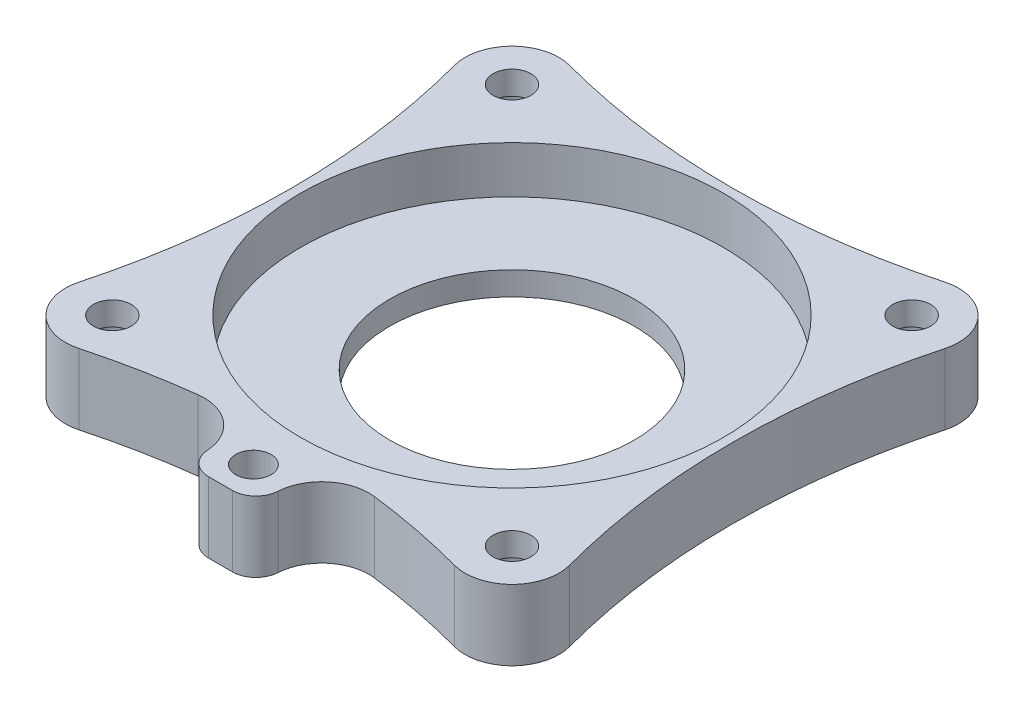
ISO-10303-21;
HEADER;
FILE_DESCRIPTION(('STEP AP214'),'2;1');
FILE_NAME('part.step','',(''),(''),'','','');
FILE_SCHEMA(('AUTOMOTIVE_DESIGN { 1 0 10303 214 1 1 1 1 }'));
ENDSEC;
DATA;
#1=APPLICATION_CONTEXT('core data for automotive mechanical design processes');
#2=APPLICATION_PROTOCOL_DEFINITION('international standard','automotive_design',2000,#1);
#3=PRODUCT_CONTEXT('',#1,'mechanical');
#4=PRODUCT('Part','Part','',(#3));
#5=PRODUCT_RELATED_PRODUCT_CATEGORY('part','',(#4));
#6=PRODUCT_DEFINITION_FORMATION('','',#4);
#7=PRODUCT_DEFINITION_CONTEXT('part definition',#1,'design');
#8=PRODUCT_DEFINITION('design','',#6,#7);
#9=PRODUCT_DEFINITION_SHAPE('','',#8);
#10=(LENGTH_UNIT() NAMED_UNIT(*) SI_UNIT(.MILLI.,.METRE.));
#11=(NAMED_UNIT(*) PLANE_ANGLE_UNIT() SI_UNIT($,.RADIAN.));
#12=(NAMED_UNIT(*) SI_UNIT($,.STERADIAN.) SOLID_ANGLE_UNIT());
#13=UNCERTAINTY_MEASURE_WITH_UNIT(LENGTH_MEASURE(1.E-05),#10,'distance_accuracy_value','');
#14=(GEOMETRIC_REPRESENTATION_CONTEXT(3) GLOBAL_UNCERTAINTY_ASSIGNED_CONTEXT((#13)) GLOBAL_UNIT_ASSIGNED_CONTEXT((#10,
#11,#12)) REPRESENTATION_CONTEXT('',''));
#15=CARTESIAN_POINT('',(0.,0.,0.));
#16=DIRECTION('',(0.,0.,1.));
#17=DIRECTION('',(1.,0.,0.));
#18=AXIS2_PLACEMENT_3D('',#15,#16,#17);
#19=CARTESIAN_POINT('',(6.35,0.,-60.325));
#20=DIRECTION('',(0.,1.,0.));
#21=DIRECTION('',(0.,0.,1.));
#22=AXIS2_PLACEMENT_3D('',#19,#20,#21);
#23=CYLINDRICAL_SURFACE('',#22,2.5527);
#24=CARTESIAN_POINT('',(6.35,9.525,-60.325));
#25=DIRECTION('',(0.,1.,0.));
#26=DIRECTION('',(0.,0.,1.));
#27=AXIS2_PLACEMENT_3D('',#24,#25,#26);
#28=CIRCLE('',#27,2.5527);
#29=CARTESIAN_POINT('',(6.35,9.525,-57.7723));
#30=VERTEX_POINT('',#29);
#31=EDGE_CURVE('E247',#30,#30,#28,.T.);
#32=ORIENTED_EDGE('',*,*,#31,.T.);
#33=EDGE_LOOP('',(#32));
#34=FACE_BOUND('',#33,.T.);
#35=CARTESIAN_POINT('',(6.35,6.35,-60.325));
#36=DIRECTION('',(0.,1.,0.));
#37=DIRECTION('',(0.,0.,1.));
#38=AXIS2_PLACEMENT_3D('',#35,#36,#37);
#39=CIRCLE('',#38,2.5527);
#40=CARTESIAN_POINT('',(6.35,6.35,-57.7723));
#41=VERTEX_POINT('',#40);
#42=EDGE_CURVE('E241',#41,#41,#39,.T.);
#43=ORIENTED_EDGE('',*,*,#42,.F.);
#44=EDGE_LOOP('',(#43));
#45=FACE_BOUND('',#44,.T.);
#46=ADVANCED_FACE('F17',(#34,#45),#23,.F.);
#47=CARTESIAN_POINT('',(60.325,0.,-60.325));
#48=DIRECTION('',(0.,1.,0.));
#49=DIRECTION('',(0.,0.,1.));
#50=AXIS2_PLACEMENT_3D('',#47,#48,#49);
#51=CYLINDRICAL_SURFACE('',#50,2.5527);
#52=CARTESIAN_POINT('',(60.325,9.525,-60.325));
#53=DIRECTION('',(0.,1.,0.));
#54=DIRECTION('',(0.,0.,1.));
#55=AXIS2_PLACEMENT_3D('',#52,#53,#54);
#56=CIRCLE('',#55,2.5527);
#57=CARTESIAN_POINT('',(60.325,9.525,-57.7723));
#58=VERTEX_POINT('',#57);
#59=EDGE_CURVE('E250',#58,#58,#56,.T.);
#60=ORIENTED_EDGE('',*,*,#59,.T.);
#61=EDGE_LOOP('',(#60));
#62=FACE_BOUND('',#61,.T.);
#63=CARTESIAN_POINT('',(60.325,6.35,-60.325));
#64=DIRECTION('',(0.,1.,0.));
#65=DIRECTION('',(0.,0.,1.));
#66=AXIS2_PLACEMENT_3D('',#63,#64,#65);
#67=CIRCLE('',#66,2.5527);
#68=CARTESIAN_POINT('',(60.325,6.35,-57.7723));
#69=VERTEX_POINT('',#68);
#70=EDGE_CURVE('E238',#69,#69,#67,.T.);
#71=ORIENTED_EDGE('',*,*,#70,.F.);
#72=EDGE_LOOP('',(#71));
#73=FACE_BOUND('',#72,.T.);
#74=ADVANCED_FACE('F385',(#62,#73),#51,.F.);
#75=CARTESIAN_POINT('',(60.325,0.,-6.35));
#76=DIRECTION('',(0.,1.,0.));
#77=DIRECTION('',(0.,0.,1.));
#78=AXIS2_PLACEMENT_3D('',#75,#76,#77);
#79=CYLINDRICAL_SURFACE('',#78,2.5527);
#80=CARTESIAN_POINT('',(60.325,9.525,-6.35));
#81=DIRECTION('',(0.,1.,0.));
#82=DIRECTION('',(0.,0.,1.));
#83=AXIS2_PLACEMENT_3D('',#80,#81,#82);
#84=CIRCLE('',#83,2.5527);
#85=CARTESIAN_POINT('',(60.325,9.525,-3.7973));
#86=VERTEX_POINT('',#85);
#87=EDGE_CURVE('E252',#86,#86,#84,.T.);
#88=ORIENTED_EDGE('',*,*,#87,.T.);
#89=EDGE_LOOP('',(#88));
#90=FACE_BOUND('',#89,.T.);
#91=CARTESIAN_POINT('',(60.325,6.35,-6.35));
#92=DIRECTION('',(0.,1.,0.));
#93=DIRECTION('',(0.,0.,1.));
#94=AXIS2_PLACEMENT_3D('',#91,#92,#93);
#95=CIRCLE('',#94,2.5527);
#96=CARTESIAN_POINT('',(60.325,6.35,-3.7973));
#97=VERTEX_POINT('',#96);
#98=EDGE_CURVE('E235',#97,#97,#95,.T.);
#99=ORIENTED_EDGE('',*,*,#98,.F.);
#100=EDGE_LOOP('',(#99));
#101=FACE_BOUND('',#100,.T.);
#102=ADVANCED_FACE('F382',(#90,#101),#79,.F.);
#103=CARTESIAN_POINT('',(6.35,0.,-6.35));
#104=DIRECTION('',(0.,1.,0.));
#105=DIRECTION('',(0.,0.,1.));
#106=AXIS2_PLACEMENT_3D('',#103,#104,#105);
#107=CYLINDRICAL_SURFACE('',#106,2.5527);
#108=CARTESIAN_POINT('',(6.35,9.525,-6.35));
#109=DIRECTION('',(0.,1.,0.));
#110=DIRECTION('',(0.,0.,1.));
#111=AXIS2_PLACEMENT_3D('',#108,#109,#110);
#112=CIRCLE('',#111,2.5527);
#113=CARTESIAN_POINT('',(6.35,9.525,-3.7973));
#114=VERTEX_POINT('',#113);
#115=EDGE_CURVE('E244',#114,#114,#112,.T.);
#116=ORIENTED_EDGE('',*,*,#115,.T.);
#117=EDGE_LOOP('',(#116));
#118=FACE_BOUND('',#117,.T.);
#119=CARTESIAN_POINT('',(6.35,6.35,-6.35));
#120=DIRECTION('',(0.,1.,0.));
#121=DIRECTION('',(0.,0.,1.));
#122=AXIS2_PLACEMENT_3D('',#119,#120,#121);
#123=CIRCLE('',#122,2.5527);
#124=CARTESIAN_POINT('',(6.35,6.35,-3.7973));
#125=VERTEX_POINT('',#124);
#126=EDGE_CURVE('E232',#125,#125,#123,.T.);
#127=ORIENTED_EDGE('',*,*,#126,.F.);
#128=EDGE_LOOP('',(#127));
#129=FACE_BOUND('',#128,.T.);
#130=ADVANCED_FACE('F379',(#118,#129),#107,.F.);
#131=CARTESIAN_POINT('',(33.3375,3.175,-33.3375));
#132=DIRECTION('',(0.,1.,0.));
#133=DIRECTION('',(0.,0.,1.));
#134=AXIS2_PLACEMENT_3D('',#131,#132,#133);
#135=CYLINDRICAL_SURFACE('',#134,28.56865);
#136=CARTESIAN_POINT('',(33.3375,9.525,-33.3375));
#137=DIRECTION('',(0.,1.,0.));
#138=DIRECTION('',(0.,0.,1.));
#139=AXIS2_PLACEMENT_3D('',#136,#137,#138);
#140=CIRCLE('',#139,28.56865);
#141=CARTESIAN_POINT('',(33.3375,9.525,-4.76885000000001));
#142=VERTEX_POINT('',#141);
#143=EDGE_CURVE('E20',#142,#142,#140,.T.);
#144=ORIENTED_EDGE('',*,*,#143,.T.);
#145=EDGE_LOOP('',(#144));
#146=FACE_BOUND('',#145,.T.);
#147=CARTESIAN_POINT('',(33.3375,3.175,-33.3375));
#148=DIRECTION('',(0.,1.,0.));
#149=DIRECTION('',(0.,0.,1.));
#150=AXIS2_PLACEMENT_3D('',#147,#148,#149);
#151=CIRCLE('',#150,28.56865);
#152=CARTESIAN_POINT('',(33.3375,3.175,-4.76885000000001));
#153=VERTEX_POINT('',#152);
#154=EDGE_CURVE('E229',#153,#153,#151,.T.);
#155=ORIENTED_EDGE('',*,*,#154,.F.);
#156=EDGE_LOOP('',(#155));
#157=FACE_BOUND('',#156,.T.);
#158=ADVANCED_FACE('F259',(#146,#157),#135,.F.);
#159=CARTESIAN_POINT('',(0.,9.525,0.));
#160=DIRECTION('',(0.,-1.,0.));
#161=DIRECTION('',(0.,0.,-1.));
#162=AXIS2_PLACEMENT_3D('',#159,#160,#161);
#163=PLANE('',#162);
#164=ORIENTED_EDGE('',*,*,#115,.F.);
#165=EDGE_LOOP('',(#164));
#166=FACE_BOUND('',#165,.T.);
#167=ORIENTED_EDGE('',*,*,#31,.F.);
#168=EDGE_LOOP('',(#167));
#169=FACE_BOUND('',#168,.T.);
#170=ORIENTED_EDGE('',*,*,#59,.F.);
#171=EDGE_LOOP('',(#170));
#172=FACE_BOUND('',#171,.T.);
#173=ORIENTED_EDGE('',*,*,#87,.F.);
#174=EDGE_LOOP('',(#173));
#175=FACE_BOUND('',#174,.T.);
#176=ORIENTED_EDGE('',*,*,#143,.F.);
#177=EDGE_LOOP('',(#176));
#178=FACE_BOUND('',#177,.T.);
#179=CARTESIAN_POINT('',(34.9437393499715,9.525,2.8575));
#180=DIRECTION('',(0.,1.,0.));
#181=DIRECTION('',(0.,0.,1.));
#182=AXIS2_PLACEMENT_3D('',#179,#180,#181);
#183=CIRCLE('',#182,3.175);
#184=CARTESIAN_POINT('',(38.112492899981,9.525,3.05656265170086));
#185=VERTEX_POINT('',#184);
#186=CARTESIAN_POINT('',(34.9437393499715,9.525,6.0325));
#187=VERTEX_POINT('',#186);
#188=EDGE_CURVE('E220',#185,#187,#183,.F.);
#189=ORIENTED_EDGE('',*,*,#188,.F.);
#190=CARTESIAN_POINT('',(44.45,9.525,3.45468795510258));
#191=DIRECTION('',(0.,1.,0.));
#192=DIRECTION('',(0.,0.,1.));
#193=AXIS2_PLACEMENT_3D('',#190,#191,#192);
#194=CIRCLE('',#193,6.35);
#195=CARTESIAN_POINT('',(45.2263737516384,9.525,-2.84767222166985));
#196=VERTEX_POINT('',#195);
#197=EDGE_CURVE('E224',#185,#196,#194,.F.);
#198=ORIENTED_EDGE('',*,*,#197,.T.);
#199=CARTESIAN_POINT('',(33.3375,9.525,93.6625));
#200=DIRECTION('',(0.,1.,0.));
#201=DIRECTION('',(0.,0.,1.));
#202=AXIS2_PLACEMENT_3D('',#199,#200,#201);
#203=CIRCLE('',#202,97.2396969418291);
#204=CARTESIAN_POINT('',(58.6706788651845,9.525,-0.21928050038964));
#205=VERTEX_POINT('',#204);
#206=EDGE_CURVE('E187',#196,#205,#203,.F.);
#207=ORIENTED_EDGE('',*,*,#206,.T.);
#208=CARTESIAN_POINT('',(60.325,9.525,-6.35));
#209=DIRECTION('',(0.,-1.,0.));
#210=DIRECTION('',(0.,0.,-1.));
#211=AXIS2_PLACEMENT_3D('',#208,#209,#210);
#212=CIRCLE('',#211,6.35);
#213=CARTESIAN_POINT('',(66.4557194996104,9.525,-8.00432113481549));
#214=VERTEX_POINT('',#213);
#215=EDGE_CURVE('E191',#214,#205,#212,.T.);
#216=ORIENTED_EDGE('',*,*,#215,.F.);
#217=CARTESIAN_POINT('',(160.3375,9.525,-33.3375));
#218=DIRECTION('',(0.,1.,0.));
#219=DIRECTION('',(0.,0.,1.));
#220=AXIS2_PLACEMENT_3D('',#217,#218,#219);
#221=CIRCLE('',#220,97.2396969418291);
#222=CARTESIAN_POINT('',(66.4557194996104,9.525,-58.6706788651845));
#223=VERTEX_POINT('',#222);
#224=EDGE_CURVE('E194',#214,#223,#221,.F.);
#225=ORIENTED_EDGE('',*,*,#224,.T.);
#226=CARTESIAN_POINT('',(60.325,9.525,-60.325));
#227=DIRECTION('',(0.,-1.,0.));
#228=DIRECTION('',(0.,0.,-1.));
#229=AXIS2_PLACEMENT_3D('',#226,#227,#228);
#230=CIRCLE('',#229,6.35);
#231=CARTESIAN_POINT('',(58.6706788651845,9.525,-66.4557194996104));
#232=VERTEX_POINT('',#231);
#233=EDGE_CURVE('E198',#232,#223,#230,.T.);
#234=ORIENTED_EDGE('',*,*,#233,.F.);
#235=CARTESIAN_POINT('',(33.3375,9.525,-160.3375));
#236=DIRECTION('',(0.,1.,0.));
#237=DIRECTION('',(0.,0.,1.));
#238=AXIS2_PLACEMENT_3D('',#235,#236,#237);
#239=CIRCLE('',#238,97.2396969418291);
#240=CARTESIAN_POINT('',(8.00432113481546,9.525,-66.4557194996104));
#241=VERTEX_POINT('',#240);
#242=EDGE_CURVE('E200',#232,#241,#239,.F.);
#243=ORIENTED_EDGE('',*,*,#242,.T.);
#244=CARTESIAN_POINT('',(6.35,9.525,-60.325));
#245=DIRECTION('',(0.,-1.,0.));
#246=DIRECTION('',(0.,0.,-1.));
#247=AXIS2_PLACEMENT_3D('',#244,#245,#246);
#248=CIRCLE('',#247,6.35);
#249=CARTESIAN_POINT('',(0.219280500389633,9.525,-58.6706788651845));
#250=VERTEX_POINT('',#249);
#251=EDGE_CURVE('E134',#250,#241,#248,.T.);
#252=ORIENTED_EDGE('',*,*,#251,.F.);
#253=CARTESIAN_POINT('',(-93.6625,9.525,-33.3375));
#254=DIRECTION('',(0.,1.,0.));
#255=DIRECTION('',(0.,0.,1.));
#256=AXIS2_PLACEMENT_3D('',#253,#254,#255);
#257=CIRCLE('',#256,97.2396969418291);
#258=CARTESIAN_POINT('',(0.21928050038964,9.525,-8.00432113481549));
#259=VERTEX_POINT('',#258);
#260=EDGE_CURVE('E203',#250,#259,#257,.F.);
#261=ORIENTED_EDGE('',*,*,#260,.T.);
#262=CARTESIAN_POINT('',(6.35,9.525,-6.35));
#263=DIRECTION('',(0.,-1.,0.));
#264=DIRECTION('',(0.,0.,-1.));
#265=AXIS2_PLACEMENT_3D('',#262,#263,#264);
#266=CIRCLE('',#265,6.35);
#267=CARTESIAN_POINT('',(8.00432113481549,9.525,-0.219280500389633));
#268=VERTEX_POINT('',#267);
#269=EDGE_CURVE('E207',#268,#259,#266,.T.);
#270=ORIENTED_EDGE('',*,*,#269,.F.);
#271=CARTESIAN_POINT('',(33.3375,9.525,93.6625));
#272=DIRECTION('',(0.,1.,0.));
#273=DIRECTION('',(0.,0.,1.));
#274=AXIS2_PLACEMENT_3D('',#271,#272,#273);
#275=CIRCLE('',#274,97.2396969418291);
#276=CARTESIAN_POINT('',(21.4486262483617,9.525,-2.84767222166985));
#277=VERTEX_POINT('',#276);
#278=EDGE_CURVE('E211',#268,#277,#275,.F.);
#279=ORIENTED_EDGE('',*,*,#278,.T.);
#280=CARTESIAN_POINT('',(22.225,9.525,3.45468795510259));
#281=DIRECTION('',(0.,1.,0.));
#282=DIRECTION('',(0.,0.,1.));
#283=AXIS2_PLACEMENT_3D('',#280,#281,#282);
#284=CIRCLE('',#283,6.35);
#285=CARTESIAN_POINT('',(28.562507100019,9.525,3.05656265170087));
#286=VERTEX_POINT('',#285);
#287=EDGE_CURVE('E214',#277,#286,#284,.F.);
#288=ORIENTED_EDGE('',*,*,#287,.T.);
#289=CARTESIAN_POINT('',(31.7312606500285,9.525,2.8575));
#290=DIRECTION('',(0.,1.,0.));
#291=DIRECTION('',(0.,0.,1.));
#292=AXIS2_PLACEMENT_3D('',#289,#290,#291);
#293=CIRCLE('',#292,3.175);
#294=CARTESIAN_POINT('',(31.7312606500285,9.525,6.0325));
#295=VERTEX_POINT('',#294);
#296=EDGE_CURVE('E216',#295,#286,#293,.F.);
#297=ORIENTED_EDGE('',*,*,#296,.F.);
#298=DIRECTION('',(1.,0.,0.));
#299=VECTOR('',#298,1.);
#300=CARTESIAN_POINT('',(28.575,9.525,6.0325));
#301=LINE('',#300,#299);
#302=EDGE_CURVE('E654',#187,#295,#301,.F.);
#303=ORIENTED_EDGE('',*,*,#302,.F.);
#304=EDGE_LOOP('',(#189,#198,#207,#216,#225,#234,#243,#252,#261,#270,#279,#288,#297,#303));
#305=FACE_BOUND('',#304,.T.);
#306=CARTESIAN_POINT('',(33.3375,9.525,1.5875));
#307=DIRECTION('',(0.,1.,0.));
#308=DIRECTION('',(0.,0.,1.));
#309=AXIS2_PLACEMENT_3D('',#306,#307,#308);
#310=CIRCLE('',#309,2.38125);
#311=CARTESIAN_POINT('',(33.3375,9.525,3.96875));
#312=VERTEX_POINT('',#311);
#313=EDGE_CURVE('E226',#312,#312,#310,.F.);
#314=ORIENTED_EDGE('',*,*,#313,.T.);
#315=EDGE_LOOP('',(#314));
#316=FACE_BOUND('',#315,.T.);
#317=ADVANCED_FACE('F262',(#166,#169,#172,#175,#178,#305,#316),#163,.F.);
#318=CARTESIAN_POINT('',(6.35,6.35,-60.325));
#319=DIRECTION('',(0.,-1.,0.));
#320=DIRECTION('',(0.,0.,-1.));
#321=AXIS2_PLACEMENT_3D('',#318,#319,#320);
#322=PLANE('',#321);
#323=ORIENTED_EDGE('',*,*,#42,.T.);
#324=EDGE_LOOP('',(#323));
#325=FACE_BOUND('',#324,.T.);
#326=CARTESIAN_POINT('',(6.35,6.35,-60.325));
#327=DIRECTION('',(0.,-1.,0.));
#328=DIRECTION('',(0.,0.,-1.));
#329=AXIS2_PLACEMENT_3D('',#326,#327,#328);
#330=CIRCLE('',#329,4.445);
#331=CARTESIAN_POINT('',(6.35,6.35,-64.77));
#332=VERTEX_POINT('',#331);
#333=EDGE_CURVE('E184',#332,#332,#330,.T.);
#334=ORIENTED_EDGE('',*,*,#333,.T.);
#335=EDGE_LOOP('',(#334));
#336=FACE_BOUND('',#335,.T.);
#337=ADVANCED_FACE('F265',(#325,#336),#322,.T.);
#338=CARTESIAN_POINT('',(60.325,6.35,-60.325));
#339=DIRECTION('',(0.,-1.,0.));
#340=DIRECTION('',(0.,0.,-1.));
#341=AXIS2_PLACEMENT_3D('',#338,#339,#340);
#342=PLANE('',#341);
#343=ORIENTED_EDGE('',*,*,#70,.T.);
#344=EDGE_LOOP('',(#343));
#345=FACE_BOUND('',#344,.T.);
#346=CARTESIAN_POINT('',(60.325,6.35,-60.325));
#347=DIRECTION('',(0.,-1.,0.));
#348=DIRECTION('',(0.,0.,-1.));
#349=AXIS2_PLACEMENT_3D('',#346,#347,#348);
#350=CIRCLE('',#349,4.44499999999998);
#351=CARTESIAN_POINT('',(60.325,6.35,-64.77));
#352=VERTEX_POINT('',#351);
#353=EDGE_CURVE('E181',#352,#352,#350,.T.);
#354=ORIENTED_EDGE('',*,*,#353,.T.);
#355=EDGE_LOOP('',(#354));
#356=FACE_BOUND('',#355,.T.);
#357=ADVANCED_FACE('F369',(#345,#356),#342,.T.);
#358=CARTESIAN_POINT('',(60.325,6.35,-6.35));
#359=DIRECTION('',(0.,-1.,0.));
#360=DIRECTION('',(0.,0.,-1.));
#361=AXIS2_PLACEMENT_3D('',#358,#359,#360);
#362=PLANE('',#361);
#363=ORIENTED_EDGE('',*,*,#98,.T.);
#364=EDGE_LOOP('',(#363));
#365=FACE_BOUND('',#364,.T.);
#366=CARTESIAN_POINT('',(60.325,6.35,-6.35));
#367=DIRECTION('',(0.,-1.,0.));
#368=DIRECTION('',(0.,0.,-1.));
#369=AXIS2_PLACEMENT_3D('',#366,#367,#368);
#370=CIRCLE('',#369,4.445);
#371=CARTESIAN_POINT('',(60.325,6.35,-10.795));
#372=VERTEX_POINT('',#371);
#373=EDGE_CURVE('E178',#372,#372,#370,.T.);
#374=ORIENTED_EDGE('',*,*,#373,.T.);
#375=EDGE_LOOP('',(#374));
#376=FACE_BOUND('',#375,.T.);
#377=ADVANCED_FACE('F365',(#365,#376),#362,.T.);
#378=CARTESIAN_POINT('',(6.35,6.35,-6.35));
#379=DIRECTION('',(0.,-1.,0.));
#380=DIRECTION('',(0.,0.,-1.));
#381=AXIS2_PLACEMENT_3D('',#378,#379,#380);
#382=PLANE('',#381);
#383=ORIENTED_EDGE('',*,*,#126,.T.);
#384=EDGE_LOOP('',(#383));
#385=FACE_BOUND('',#384,.T.);
#386=CARTESIAN_POINT('',(6.35,6.35,-6.35));
#387=DIRECTION('',(0.,-1.,0.));
#388=DIRECTION('',(0.,0.,-1.));
#389=AXIS2_PLACEMENT_3D('',#386,#387,#388);
#390=CIRCLE('',#389,4.445);
#391=CARTESIAN_POINT('',(6.35,6.35,-10.795));
#392=VERTEX_POINT('',#391);
#393=EDGE_CURVE('E175',#392,#392,#390,.T.);
#394=ORIENTED_EDGE('',*,*,#393,.T.);
#395=EDGE_LOOP('',(#394));
#396=FACE_BOUND('',#395,.T.);
#397=ADVANCED_FACE('F361',(#385,#396),#382,.T.);
#398=CARTESIAN_POINT('',(33.3375,3.175,-33.3375));
#399=DIRECTION('',(0.,1.,0.));
#400=DIRECTION('',(0.,0.,1.));
#401=AXIS2_PLACEMENT_3D('',#398,#399,#400);
#402=PLANE('',#401);
#403=CARTESIAN_POINT('',(33.3375,3.175,-33.3375));
#404=DIRECTION('',(0.,1.,0.));
#405=DIRECTION('',(0.,0.,1.));
#406=AXIS2_PLACEMENT_3D('',#403,#404,#405);
#407=CIRCLE('',#406,16.51);
#408=CARTESIAN_POINT('',(33.3375,3.175,-16.8275));
#409=VERTEX_POINT('',#408);
#410=EDGE_CURVE('E172',#409,#409,#407,.F.);
#411=ORIENTED_EDGE('',*,*,#410,.T.);
#412=EDGE_LOOP('',(#411));
#413=FACE_BOUND('',#412,.T.);
#414=ORIENTED_EDGE('',*,*,#154,.T.);
#415=EDGE_LOOP('',(#414));
#416=FACE_BOUND('',#415,.T.);
#417=ADVANCED_FACE('F278',(#413,#416),#402,.T.);
#418=CARTESIAN_POINT('',(33.3375,0.,1.5875));
#419=DIRECTION('',(0.,1.,0.));
#420=DIRECTION('',(0.,0.,1.));
#421=AXIS2_PLACEMENT_3D('',#418,#419,#420);
#422=CYLINDRICAL_SURFACE('',#421,2.38125);
#423=ORIENTED_EDGE('',*,*,#313,.F.);
#424=EDGE_LOOP('',(#423));
#425=FACE_BOUND('',#424,.T.);
#426=CARTESIAN_POINT('',(33.3375,0.,1.5875));
#427=DIRECTION('',(0.,1.,0.));
#428=DIRECTION('',(0.,0.,1.));
#429=AXIS2_PLACEMENT_3D('',#426,#427,#428);
#430=CIRCLE('',#429,2.38125);
#431=CARTESIAN_POINT('',(33.3375,0.,3.96875));
#432=VERTEX_POINT('',#431);
#433=EDGE_CURVE('E169',#432,#432,#430,.T.);
#434=ORIENTED_EDGE('',*,*,#433,.F.);
#435=EDGE_LOOP('',(#434));
#436=FACE_BOUND('',#435,.T.);
#437=ADVANCED_FACE('F274',(#425,#436),#422,.F.);
#438=CARTESIAN_POINT('',(44.45,0.,3.45468795510258));
#439=DIRECTION('',(0.,1.,0.));
#440=DIRECTION('',(0.,0.,1.));
#441=AXIS2_PLACEMENT_3D('',#438,#439,#440);
#442=CYLINDRICAL_SURFACE('',#441,6.35);
#443=DIRECTION('',(0.,1.,0.));
#444=VECTOR('',#443,1.);
#445=CARTESIAN_POINT('',(38.112492899981,0.,3.05656265170086));
#446=LINE('',#445,#444);
#447=CARTESIAN_POINT('',(38.112492899981,0.,3.05656265170086));
#448=VERTEX_POINT('',#447);
#449=EDGE_CURVE('E223',#448,#185,#446,.T.);
#450=ORIENTED_EDGE('',*,*,#449,.F.);
#451=CARTESIAN_POINT('',(44.45,0.,3.45468795510258));
#452=DIRECTION('',(0.,1.,0.));
#453=DIRECTION('',(0.,0.,1.));
#454=AXIS2_PLACEMENT_3D('',#451,#452,#453);
#455=CIRCLE('',#454,6.35);
#456=CARTESIAN_POINT('',(45.2263737516384,0.,-2.84767222166985));
#457=VERTEX_POINT('',#456);
#458=EDGE_CURVE('E166',#457,#448,#455,.T.);
#459=ORIENTED_EDGE('',*,*,#458,.F.);
#460=DIRECTION('',(0.,1.,0.));
#461=VECTOR('',#460,1.);
#462=CARTESIAN_POINT('',(45.2263737516384,0.,-2.84767222166984));
#463=LINE('',#462,#461);
#464=EDGE_CURVE('E190',#457,#196,#463,.T.);
#465=ORIENTED_EDGE('',*,*,#464,.T.);
#466=ORIENTED_EDGE('',*,*,#197,.F.);
#467=EDGE_LOOP('',(#450,#459,#465,#466));
#468=FACE_BOUND('',#467,.T.);
#469=ADVANCED_FACE('F277',(#468),#442,.F.);
#470=CARTESIAN_POINT('',(34.9437393499715,0.,2.8575));
#471=DIRECTION('',(0.,1.,0.));
#472=DIRECTION('',(0.,0.,1.));
#473=AXIS2_PLACEMENT_3D('',#470,#471,#472);
#474=CYLINDRICAL_SURFACE('',#473,3.175);
#475=ORIENTED_EDGE('',*,*,#188,.T.);
#476=DIRECTION('',(0.,1.,0.));
#477=VECTOR('',#476,1.);
#478=CARTESIAN_POINT('',(34.9437393499715,-14.3014631768921,6.0325));
#479=LINE('',#478,#477);
#480=CARTESIAN_POINT('',(34.9437393499715,0.,6.0325));
#481=VERTEX_POINT('',#480);
#482=EDGE_CURVE('E222',#481,#187,#479,.T.);
#483=ORIENTED_EDGE('',*,*,#482,.F.);
#484=CARTESIAN_POINT('',(34.9437393499715,0.,2.8575));
#485=DIRECTION('',(0.,1.,0.));
#486=DIRECTION('',(0.,0.,1.));
#487=AXIS2_PLACEMENT_3D('',#484,#485,#486);
#488=CIRCLE('',#487,3.175);
#489=EDGE_CURVE('E163',#448,#481,#488,.F.);
#490=ORIENTED_EDGE('',*,*,#489,.F.);
#491=ORIENTED_EDGE('',*,*,#449,.T.);
#492=EDGE_LOOP('',(#475,#483,#490,#491));
#493=FACE_BOUND('',#492,.T.);
#494=ADVANCED_FACE('F351',(#493),#474,.T.);
#495=CARTESIAN_POINT('',(28.575,-14.3014631768921,6.0325));
#496=DIRECTION('',(0.,0.,1.));
#497=DIRECTION('',(1.,0.,0.));
#498=AXIS2_PLACEMENT_3D('',#495,#496,#497);
#499=PLANE('',#498);
#500=ORIENTED_EDGE('',*,*,#302,.T.);
#501=DIRECTION('',(0.,1.,0.));
#502=VECTOR('',#501,1.);
#503=CARTESIAN_POINT('',(31.7312606500285,0.,6.0325));
#504=LINE('',#503,#502);
#505=CARTESIAN_POINT('',(31.7312606500285,0.,6.0325));
#506=VERTEX_POINT('',#505);
#507=EDGE_CURVE('E219',#506,#295,#504,.T.);
#508=ORIENTED_EDGE('',*,*,#507,.F.);
#509=DIRECTION('',(1.,0.,0.));
#510=VECTOR('',#509,1.);
#511=CARTESIAN_POINT('',(0.,0.,6.0325));
#512=LINE('',#511,#510);
#513=EDGE_CURVE('E162',#481,#506,#512,.F.);
#514=ORIENTED_EDGE('',*,*,#513,.F.);
#515=ORIENTED_EDGE('',*,*,#482,.T.);
#516=EDGE_LOOP('',(#500,#508,#514,#515));
#517=FACE_BOUND('',#516,.T.);
#518=ADVANCED_FACE('F347',(#517),#499,.T.);
#519=CARTESIAN_POINT('',(31.7312606500285,0.,2.8575));
#520=DIRECTION('',(0.,1.,0.));
#521=DIRECTION('',(0.,0.,1.));
#522=AXIS2_PLACEMENT_3D('',#519,#520,#521);
#523=CYLINDRICAL_SURFACE('',#522,3.175);
#524=ORIENTED_EDGE('',*,*,#296,.T.);
#525=DIRECTION('',(0.,1.,0.));
#526=VECTOR('',#525,1.);
#527=CARTESIAN_POINT('',(28.562507100019,0.,3.05656265170087));
#528=LINE('',#527,#526);
#529=CARTESIAN_POINT('',(28.562507100019,0.,3.05656265170087));
#530=VERTEX_POINT('',#529);
#531=EDGE_CURVE('E213',#286,#530,#528,.F.);
#532=ORIENTED_EDGE('',*,*,#531,.T.);
#533=CARTESIAN_POINT('',(31.7312606500285,0.,2.8575));
#534=DIRECTION('',(0.,1.,0.));
#535=DIRECTION('',(0.,0.,1.));
#536=AXIS2_PLACEMENT_3D('',#533,#534,#535);
#537=CIRCLE('',#536,3.175);
#538=EDGE_CURVE('E159',#506,#530,#537,.F.);
#539=ORIENTED_EDGE('',*,*,#538,.F.);
#540=ORIENTED_EDGE('',*,*,#507,.T.);
#541=EDGE_LOOP('',(#524,#532,#539,#540));
#542=FACE_BOUND('',#541,.T.);
#543=ADVANCED_FACE('F343',(#542),#523,.T.);
#544=CARTESIAN_POINT('',(22.225,0.,3.45468795510259));
#545=DIRECTION('',(0.,1.,0.));
#546=DIRECTION('',(0.,0.,1.));
#547=AXIS2_PLACEMENT_3D('',#544,#545,#546);
#548=CYLINDRICAL_SURFACE('',#547,6.35);
#549=ORIENTED_EDGE('',*,*,#531,.F.);
#550=ORIENTED_EDGE('',*,*,#287,.F.);
#551=DIRECTION('',(0.,1.,0.));
#552=VECTOR('',#551,1.);
#553=CARTESIAN_POINT('',(21.4486262483617,0.,-2.84767222166986));
#554=LINE('',#553,#552);
#555=CARTESIAN_POINT('',(21.4486262483617,0.,-2.84767222166985));
#556=VERTEX_POINT('',#555);
#557=EDGE_CURVE('E210',#277,#556,#554,.F.);
#558=ORIENTED_EDGE('',*,*,#557,.T.);
#559=CARTESIAN_POINT('',(22.225,0.,3.45468795510259));
#560=DIRECTION('',(0.,1.,0.));
#561=DIRECTION('',(0.,0.,1.));
#562=AXIS2_PLACEMENT_3D('',#559,#560,#561);
#563=CIRCLE('',#562,6.35);
#564=EDGE_CURVE('E156',#530,#556,#563,.T.);
#565=ORIENTED_EDGE('',*,*,#564,.F.);
#566=EDGE_LOOP('',(#549,#550,#558,#565));
#567=FACE_BOUND('',#566,.T.);
#568=ADVANCED_FACE('F339',(#567),#548,.F.);
#569=CARTESIAN_POINT('',(33.3375,0.,93.6625));
#570=DIRECTION('',(0.,1.,0.));
#571=DIRECTION('',(0.,0.,1.));
#572=AXIS2_PLACEMENT_3D('',#569,#570,#571);
#573=CYLINDRICAL_SURFACE('',#572,97.2396969418291);
#574=ORIENTED_EDGE('',*,*,#557,.F.);
#575=ORIENTED_EDGE('',*,*,#278,.F.);
#576=DIRECTION('',(0.,-1.,0.));
#577=VECTOR('',#576,1.);
#578=CARTESIAN_POINT('',(8.00432113481549,9.525,-0.219280500389632));
#579=LINE('',#578,#577);
#580=CARTESIAN_POINT('',(8.00432113481549,0.,-0.219280500389633));
#581=VERTEX_POINT('',#580);
#582=EDGE_CURVE('E209',#581,#268,#579,.F.);
#583=ORIENTED_EDGE('',*,*,#582,.F.);
#584=CARTESIAN_POINT('',(33.3375,0.,93.6625));
#585=DIRECTION('',(0.,1.,0.));
#586=DIRECTION('',(0.,0.,1.));
#587=AXIS2_PLACEMENT_3D('',#584,#585,#586);
#588=CIRCLE('',#587,97.2396969418291);
#589=EDGE_CURVE('E153',#556,#581,#588,.T.);
#590=ORIENTED_EDGE('',*,*,#589,.F.);
#591=EDGE_LOOP('',(#574,#575,#583,#590));
#592=FACE_BOUND('',#591,.T.);
#593=ADVANCED_FACE('F335',(#592),#573,.F.);
#594=CARTESIAN_POINT('',(6.35,9.525,-6.35));
#595=DIRECTION('',(0.,-1.,0.));
#596=DIRECTION('',(0.,0.,-1.));
#597=AXIS2_PLACEMENT_3D('',#594,#595,#596);
#598=CYLINDRICAL_SURFACE('',#597,6.35);
#599=CARTESIAN_POINT('',(6.35,0.,-6.35));
#600=DIRECTION('',(0.,-1.,0.));
#601=DIRECTION('',(0.,0.,-1.));
#602=AXIS2_PLACEMENT_3D('',#599,#600,#601);
#603=CIRCLE('',#602,6.35);
#604=CARTESIAN_POINT('',(0.219280500389642,0.,-8.00432113481549));
#605=VERTEX_POINT('',#604);
#606=EDGE_CURVE('E151',#581,#605,#603,.T.);
#607=ORIENTED_EDGE('',*,*,#606,.F.);
#608=ORIENTED_EDGE('',*,*,#582,.T.);
#609=ORIENTED_EDGE('',*,*,#269,.T.);
#610=DIRECTION('',(0.,1.,0.));
#611=VECTOR('',#610,1.);
#612=CARTESIAN_POINT('',(0.219280500389649,0.,-8.00432113481549));
#613=LINE('',#612,#611);
#614=EDGE_CURVE('E206',#259,#605,#613,.F.);
#615=ORIENTED_EDGE('',*,*,#614,.T.);
#616=EDGE_LOOP('',(#607,#608,#609,#615));
#617=FACE_BOUND('',#616,.T.);
#618=ADVANCED_FACE('F331',(#617),#598,.T.);
#619=CARTESIAN_POINT('',(-93.6625,0.,-33.3375));
#620=DIRECTION('',(0.,1.,0.));
#621=DIRECTION('',(0.,0.,1.));
#622=AXIS2_PLACEMENT_3D('',#619,#620,#621);
#623=CYLINDRICAL_SURFACE('',#622,97.2396969418291);
#624=DIRECTION('',(0.,-1.,0.));
#625=VECTOR('',#624,1.);
#626=CARTESIAN_POINT('',(0.219280500389631,9.525,-58.6706788651845));
#627=LINE('',#626,#625);
#628=CARTESIAN_POINT('',(0.219280500389633,0.,-58.6706788651845));
#629=VERTEX_POINT('',#628);
#630=EDGE_CURVE('E139',#629,#250,#627,.F.);
#631=ORIENTED_EDGE('',*,*,#630,.F.);
#632=CARTESIAN_POINT('',(-93.6625,0.,-33.3375));
#633=DIRECTION('',(0.,1.,0.));
#634=DIRECTION('',(0.,0.,1.));
#635=AXIS2_PLACEMENT_3D('',#632,#633,#634);
#636=CIRCLE('',#635,97.2396969418291);
#637=EDGE_CURVE('E127',#605,#629,#636,.T.);
#638=ORIENTED_EDGE('',*,*,#637,.F.);
#639=ORIENTED_EDGE('',*,*,#614,.F.);
#640=ORIENTED_EDGE('',*,*,#260,.F.);
#641=EDGE_LOOP('',(#631,#638,#639,#640));
#642=FACE_BOUND('',#641,.T.);
#643=ADVANCED_FACE('F328',(#642),#623,.F.);
#644=CARTESIAN_POINT('',(6.35,9.525,-60.325));
#645=DIRECTION('',(0.,-1.,0.));
#646=DIRECTION('',(0.,0.,-1.));
#647=AXIS2_PLACEMENT_3D('',#644,#645,#646);
#648=CYLINDRICAL_SURFACE('',#647,6.35);
#649=CARTESIAN_POINT('',(6.35,0.,-60.325));
#650=DIRECTION('',(0.,-1.,0.));
#651=DIRECTION('',(0.,0.,-1.));
#652=AXIS2_PLACEMENT_3D('',#649,#650,#651);
#653=CIRCLE('',#652,6.35);
#654=CARTESIAN_POINT('',(8.00432113481546,0.,-66.4557194996104));
#655=VERTEX_POINT('',#654);
#656=EDGE_CURVE('E120',#629,#655,#653,.T.);
#657=ORIENTED_EDGE('',*,*,#656,.F.);
#658=ORIENTED_EDGE('',*,*,#630,.T.);
#659=ORIENTED_EDGE('',*,*,#251,.T.);
#660=DIRECTION('',(0.,1.,0.));
#661=VECTOR('',#660,1.);
#662=CARTESIAN_POINT('',(8.00432113481543,0.,-66.4557194996104));
#663=LINE('',#662,#661);
#664=EDGE_CURVE('E132',#241,#655,#663,.F.);
#665=ORIENTED_EDGE('',*,*,#664,.T.);
#666=EDGE_LOOP('',(#657,#658,#659,#665));
#667=FACE_BOUND('',#666,.T.);
#668=ADVANCED_FACE('F133',(#667),#648,.T.);
#669=CARTESIAN_POINT('',(33.3375,0.,-160.3375));
#670=DIRECTION('',(0.,1.,0.));
#671=DIRECTION('',(0.,0.,1.));
#672=AXIS2_PLACEMENT_3D('',#669,#670,#671);
#673=CYLINDRICAL_SURFACE('',#672,97.2396969418291);
#674=DIRECTION('',(0.,1.,0.));
#675=VECTOR('',#674,1.);
#676=CARTESIAN_POINT('',(58.6706788651845,0.,-66.4557194996103));
#677=LINE('',#676,#675);
#678=CARTESIAN_POINT('',(58.6706788651845,0.,-66.4557194996104));
#679=VERTEX_POINT('',#678);
#680=EDGE_CURVE('E138',#679,#232,#677,.T.);
#681=ORIENTED_EDGE('',*,*,#680,.F.);
#682=CARTESIAN_POINT('',(33.3375,0.,-160.3375));
#683=DIRECTION('',(0.,1.,0.));
#684=DIRECTION('',(0.,0.,1.));
#685=AXIS2_PLACEMENT_3D('',#682,#683,#684);
#686=CIRCLE('',#685,97.2396969418291);
#687=EDGE_CURVE('E116',#655,#679,#686,.T.);
#688=ORIENTED_EDGE('',*,*,#687,.F.);
#689=ORIENTED_EDGE('',*,*,#664,.F.);
#690=ORIENTED_EDGE('',*,*,#242,.F.);
#691=EDGE_LOOP('',(#681,#688,#689,#690));
#692=FACE_BOUND('',#691,.T.);
#693=ADVANCED_FACE('F142',(#692),#673,.F.);
#694=CARTESIAN_POINT('',(60.325,9.525,-60.325));
#695=DIRECTION('',(0.,-1.,0.));
#696=DIRECTION('',(0.,0.,-1.));
#697=AXIS2_PLACEMENT_3D('',#694,#695,#696);
#698=CYLINDRICAL_SURFACE('',#697,6.35);
#699=DIRECTION('',(0.,1.,0.));
#700=VECTOR('',#699,1.);
#701=CARTESIAN_POINT('',(66.4557194996104,0.,-58.6706788651846));
#702=LINE('',#701,#700);
#703=CARTESIAN_POINT('',(66.4557194996104,0.,-58.6706788651845));
#704=VERTEX_POINT('',#703);
#705=EDGE_CURVE('E197',#223,#704,#702,.F.);
#706=ORIENTED_EDGE('',*,*,#705,.T.);
#707=CARTESIAN_POINT('',(60.325,0.,-60.325));
#708=DIRECTION('',(0.,-1.,0.));
#709=DIRECTION('',(0.,0.,-1.));
#710=AXIS2_PLACEMENT_3D('',#707,#708,#709);
#711=CIRCLE('',#710,6.35);
#712=EDGE_CURVE('E144',#679,#704,#711,.T.);
#713=ORIENTED_EDGE('',*,*,#712,.F.);
#714=ORIENTED_EDGE('',*,*,#680,.T.);
#715=ORIENTED_EDGE('',*,*,#233,.T.);
#716=EDGE_LOOP('',(#706,#713,#714,#715));
#717=FACE_BOUND('',#716,.T.);
#718=ADVANCED_FACE('F319',(#717),#698,.T.);
#719=CARTESIAN_POINT('',(160.3375,0.,-33.3375));
#720=DIRECTION('',(0.,1.,0.));
#721=DIRECTION('',(0.,0.,1.));
#722=AXIS2_PLACEMENT_3D('',#719,#720,#721);
#723=CYLINDRICAL_SURFACE('',#722,97.2396969418291);
#724=DIRECTION('',(0.,-1.,0.));
#725=VECTOR('',#724,1.);
#726=CARTESIAN_POINT('',(66.4557194996104,9.525,-8.00432113481549));
#727=LINE('',#726,#725);
#728=CARTESIAN_POINT('',(66.4557194996104,0.,-8.00432113481549));
#729=VERTEX_POINT('',#728);
#730=EDGE_CURVE('E193',#729,#214,#727,.F.);
#731=ORIENTED_EDGE('',*,*,#730,.F.);
#732=CARTESIAN_POINT('',(160.3375,0.,-33.3375));
#733=DIRECTION('',(0.,1.,0.));
#734=DIRECTION('',(0.,0.,1.));
#735=AXIS2_PLACEMENT_3D('',#732,#733,#734);
#736=CIRCLE('',#735,97.2396969418291);
#737=EDGE_CURVE('E146',#704,#729,#736,.T.);
#738=ORIENTED_EDGE('',*,*,#737,.F.);
#739=ORIENTED_EDGE('',*,*,#705,.F.);
#740=ORIENTED_EDGE('',*,*,#224,.F.);
#741=EDGE_LOOP('',(#731,#738,#739,#740));
#742=FACE_BOUND('',#741,.T.);
#743=ADVANCED_FACE('F316',(#742),#723,.F.);
#744=CARTESIAN_POINT('',(60.325,9.525,-6.35));
#745=DIRECTION('',(0.,-1.,0.));
#746=DIRECTION('',(0.,0.,-1.));
#747=AXIS2_PLACEMENT_3D('',#744,#745,#746);
#748=CYLINDRICAL_SURFACE('',#747,6.35);
#749=CARTESIAN_POINT('',(60.325,0.,-6.35));
#750=DIRECTION('',(0.,-1.,0.));
#751=DIRECTION('',(0.,0.,-1.));
#752=AXIS2_PLACEMENT_3D('',#749,#750,#751);
#753=CIRCLE('',#752,6.35);
#754=CARTESIAN_POINT('',(58.6706788651845,0.,-0.219280500389649));
#755=VERTEX_POINT('',#754);
#756=EDGE_CURVE('E628',#729,#755,#753,.T.);
#757=ORIENTED_EDGE('',*,*,#756,.F.);
#758=ORIENTED_EDGE('',*,*,#730,.T.);
#759=ORIENTED_EDGE('',*,*,#215,.T.);
#760=DIRECTION('',(0.,1.,0.));
#761=VECTOR('',#760,1.);
#762=CARTESIAN_POINT('',(58.6706788651845,0.,-0.219280500389649));
#763=LINE('',#762,#761);
#764=EDGE_CURVE('E35',#205,#755,#763,.F.);
#765=ORIENTED_EDGE('',*,*,#764,.T.);
#766=EDGE_LOOP('',(#757,#758,#759,#765));
#767=FACE_BOUND('',#766,.T.);
#768=ADVANCED_FACE('F312',(#767),#748,.T.);
#769=CARTESIAN_POINT('',(33.3375,0.,93.6625));
#770=DIRECTION('',(0.,1.,0.));
#771=DIRECTION('',(0.,0.,1.));
#772=AXIS2_PLACEMENT_3D('',#769,#770,#771);
#773=CYLINDRICAL_SURFACE('',#772,97.2396969418291);
#774=ORIENTED_EDGE('',*,*,#464,.F.);
#775=CARTESIAN_POINT('',(33.3375,0.,93.6625));
#776=DIRECTION('',(0.,1.,0.));
#777=DIRECTION('',(0.,0.,1.));
#778=AXIS2_PLACEMENT_3D('',#775,#776,#777);
#779=CIRCLE('',#778,97.2396969418291);
#780=EDGE_CURVE('E626',#755,#457,#779,.T.);
#781=ORIENTED_EDGE('',*,*,#780,.F.);
#782=ORIENTED_EDGE('',*,*,#764,.F.);
#783=ORIENTED_EDGE('',*,*,#206,.F.);
#784=EDGE_LOOP('',(#774,#781,#782,#783));
#785=FACE_BOUND('',#784,.T.);
#786=ADVANCED_FACE('F308',(#785),#773,.F.);
#787=CARTESIAN_POINT('',(6.35,6.35,-60.325));
#788=DIRECTION('',(0.,-1.,0.));
#789=DIRECTION('',(0.,0.,-1.));
#790=AXIS2_PLACEMENT_3D('',#787,#788,#789);
#791=CYLINDRICAL_SURFACE('',#790,4.445);
#792=CARTESIAN_POINT('',(6.35,0.,-60.325));
#793=DIRECTION('',(0.,-1.,0.));
#794=DIRECTION('',(0.,0.,-1.));
#795=AXIS2_PLACEMENT_3D('',#792,#793,#794);
#796=CIRCLE('',#795,4.445);
#797=CARTESIAN_POINT('',(6.35,0.,-64.77));
#798=VERTEX_POINT('',#797);
#799=EDGE_CURVE('E629',#798,#798,#796,.F.);
#800=ORIENTED_EDGE('',*,*,#799,.F.);
#801=EDGE_LOOP('',(#800));
#802=FACE_BOUND('',#801,.T.);
#803=ORIENTED_EDGE('',*,*,#333,.F.);
#804=EDGE_LOOP('',(#803));
#805=FACE_BOUND('',#804,.T.);
#806=ADVANCED_FACE('F304',(#802,#805),#791,.F.);
#807=CARTESIAN_POINT('',(60.325,6.35,-60.325));
#808=DIRECTION('',(0.,-1.,0.));
#809=DIRECTION('',(0.,0.,-1.));
#810=AXIS2_PLACEMENT_3D('',#807,#808,#809);
#811=CYLINDRICAL_SURFACE('',#810,4.44499999999998);
#812=CARTESIAN_POINT('',(60.325,0.,-60.325));
#813=DIRECTION('',(0.,-1.,0.));
#814=DIRECTION('',(0.,0.,-1.));
#815=AXIS2_PLACEMENT_3D('',#812,#813,#814);
#816=CIRCLE('',#815,4.44499999999998);
#817=CARTESIAN_POINT('',(60.325,0.,-64.77));
#818=VERTEX_POINT('',#817);
#819=EDGE_CURVE('E632',#818,#818,#816,.F.);
#820=ORIENTED_EDGE('',*,*,#819,.F.);
#821=EDGE_LOOP('',(#820));
#822=FACE_BOUND('',#821,.T.);
#823=ORIENTED_EDGE('',*,*,#353,.F.);
#824=EDGE_LOOP('',(#823));
#825=FACE_BOUND('',#824,.T.);
#826=ADVANCED_FACE('F300',(#822,#825),#811,.F.);
#827=CARTESIAN_POINT('',(60.325,6.35,-6.35));
#828=DIRECTION('',(0.,-1.,0.));
#829=DIRECTION('',(0.,0.,-1.));
#830=AXIS2_PLACEMENT_3D('',#827,#828,#829);
#831=CYLINDRICAL_SURFACE('',#830,4.445);
#832=CARTESIAN_POINT('',(60.325,0.,-6.35));
#833=DIRECTION('',(0.,-1.,0.));
#834=DIRECTION('',(0.,0.,-1.));
#835=AXIS2_PLACEMENT_3D('',#832,#833,#834);
#836=CIRCLE('',#835,4.445);
#837=CARTESIAN_POINT('',(60.325,0.,-10.795));
#838=VERTEX_POINT('',#837);
#839=EDGE_CURVE('E659',#838,#838,#836,.F.);
#840=ORIENTED_EDGE('',*,*,#839,.F.);
#841=EDGE_LOOP('',(#840));
#842=FACE_BOUND('',#841,.T.);
#843=ORIENTED_EDGE('',*,*,#373,.F.);
#844=EDGE_LOOP('',(#843));
#845=FACE_BOUND('',#844,.T.);
#846=ADVANCED_FACE('F296',(#842,#845),#831,.F.);
#847=CARTESIAN_POINT('',(6.35,6.35,-6.35));
#848=DIRECTION('',(0.,-1.,0.));
#849=DIRECTION('',(0.,0.,-1.));
#850=AXIS2_PLACEMENT_3D('',#847,#848,#849);
#851=CYLINDRICAL_SURFACE('',#850,4.445);
#852=CARTESIAN_POINT('',(6.35,0.,-6.35));
#853=DIRECTION('',(0.,-1.,0.));
#854=DIRECTION('',(0.,0.,-1.));
#855=AXIS2_PLACEMENT_3D('',#852,#853,#854);
#856=CIRCLE('',#855,4.445);
#857=CARTESIAN_POINT('',(6.35,0.,-10.795));
#858=VERTEX_POINT('',#857);
#859=EDGE_CURVE('E26',#858,#858,#856,.F.);
#860=ORIENTED_EDGE('',*,*,#859,.F.);
#861=EDGE_LOOP('',(#860));
#862=FACE_BOUND('',#861,.T.);
#863=ORIENTED_EDGE('',*,*,#393,.F.);
#864=EDGE_LOOP('',(#863));
#865=FACE_BOUND('',#864,.T.);
#866=ADVANCED_FACE('F289',(#862,#865),#851,.F.);
#867=CARTESIAN_POINT('',(33.3375,0.,-33.3375));
#868=DIRECTION('',(0.,1.,0.));
#869=DIRECTION('',(0.,0.,1.));
#870=AXIS2_PLACEMENT_3D('',#867,#868,#869);
#871=CYLINDRICAL_SURFACE('',#870,16.51);
#872=ORIENTED_EDGE('',*,*,#410,.F.);
#873=EDGE_LOOP('',(#872));
#874=FACE_BOUND('',#873,.T.);
#875=CARTESIAN_POINT('',(33.3375,0.,-33.3375));
#876=DIRECTION('',(0.,1.,0.));
#877=DIRECTION('',(0.,0.,1.));
#878=AXIS2_PLACEMENT_3D('',#875,#876,#877);
#879=CIRCLE('',#878,16.51);
#880=CARTESIAN_POINT('',(33.3375,0.,-16.8275));
#881=VERTEX_POINT('',#880);
#882=EDGE_CURVE('E11',#881,#881,#879,.T.);
#883=ORIENTED_EDGE('',*,*,#882,.F.);
#884=EDGE_LOOP('',(#883));
#885=FACE_BOUND('',#884,.T.);
#886=ADVANCED_FACE('F282',(#874,#885),#871,.F.);
#887=CARTESIAN_POINT('',(0.,0.,0.));
#888=DIRECTION('',(0.,-1.,0.));
#889=DIRECTION('',(0.,0.,-1.));
#890=AXIS2_PLACEMENT_3D('',#887,#888,#889);
#891=PLANE('',#890);
#892=ORIENTED_EDGE('',*,*,#882,.T.);
#893=EDGE_LOOP('',(#892));
#894=FACE_BOUND('',#893,.T.);
#895=ORIENTED_EDGE('',*,*,#859,.T.);
#896=EDGE_LOOP('',(#895));
#897=FACE_BOUND('',#896,.T.);
#898=ORIENTED_EDGE('',*,*,#839,.T.);
#899=EDGE_LOOP('',(#898));
#900=FACE_BOUND('',#899,.T.);
#901=ORIENTED_EDGE('',*,*,#819,.T.);
#902=EDGE_LOOP('',(#901));
#903=FACE_BOUND('',#902,.T.);
#904=ORIENTED_EDGE('',*,*,#799,.T.);
#905=EDGE_LOOP('',(#904));
#906=FACE_BOUND('',#905,.T.);
#907=ORIENTED_EDGE('',*,*,#756,.T.);
#908=ORIENTED_EDGE('',*,*,#780,.T.);
#909=ORIENTED_EDGE('',*,*,#458,.T.);
#910=ORIENTED_EDGE('',*,*,#489,.T.);
#911=ORIENTED_EDGE('',*,*,#513,.T.);
#912=ORIENTED_EDGE('',*,*,#538,.T.);
#913=ORIENTED_EDGE('',*,*,#564,.T.);
#914=ORIENTED_EDGE('',*,*,#589,.T.);
#915=ORIENTED_EDGE('',*,*,#606,.T.);
#916=ORIENTED_EDGE('',*,*,#637,.T.);
#917=ORIENTED_EDGE('',*,*,#656,.T.);
#918=ORIENTED_EDGE('',*,*,#687,.T.);
#919=ORIENTED_EDGE('',*,*,#712,.T.);
#920=ORIENTED_EDGE('',*,*,#737,.T.);
#921=EDGE_LOOP('',(#907,#908,#909,#910,#911,#912,#913,#914,#915,#916,#917,#918,#919,#920));
#922=FACE_BOUND('',#921,.T.);
#923=ORIENTED_EDGE('',*,*,#433,.T.);
#924=EDGE_LOOP('',(#923));
#925=FACE_BOUND('',#924,.T.);
#926=ADVANCED_FACE('F123',(#894,#897,#900,#903,#906,#922,#925),#891,.T.);
#927=CLOSED_SHELL('',(#46,#74,#102,#130,#158,#317,#337,#357,#377,#397,#417,#437,#469,#494,#518,
#543,#568,#593,#618,#643,#668,#693,#718,#743,#768,#786,#806,#826,#846,#866,#886,#926));
#928=MANIFOLD_SOLID_BREP('B1',#927);
#929=ADVANCED_BREP_SHAPE_REPRESENTATION('',(#18,#928),#14);
#930=SHAPE_DEFINITION_REPRESENTATION(#9,#929);
ENDSEC;
END-ISO-10303-21;
